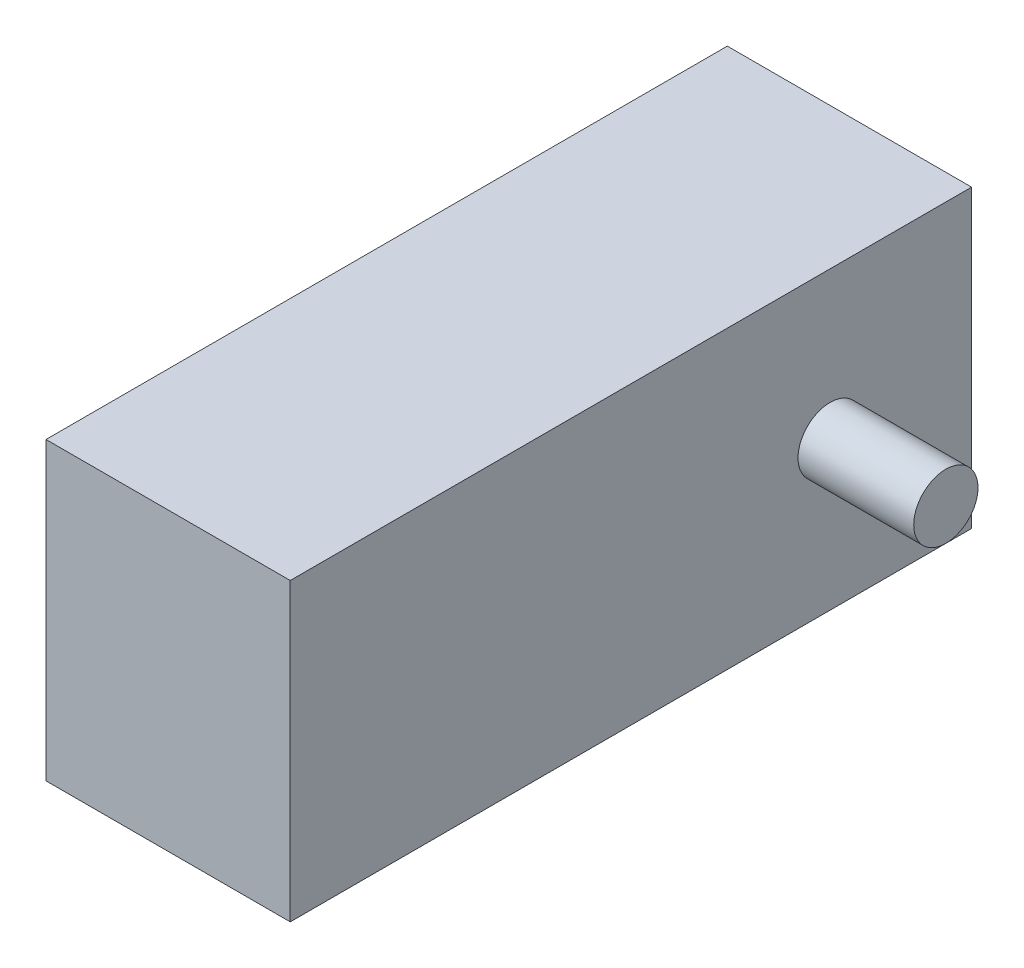
ISO-10303-21;
HEADER;
FILE_DESCRIPTION(('STEP AP214'),'2;1');
FILE_NAME('part.step','',(''),(''),'','','');
FILE_SCHEMA(('AUTOMOTIVE_DESIGN { 1 0 10303 214 1 1 1 1 }'));
ENDSEC;
DATA;
#1=APPLICATION_CONTEXT('core data for automotive mechanical design processes');
#2=APPLICATION_PROTOCOL_DEFINITION('international standard','automotive_design',2000,#1);
#3=PRODUCT_CONTEXT('',#1,'mechanical');
#4=PRODUCT('Part','Part','',(#3));
#5=PRODUCT_RELATED_PRODUCT_CATEGORY('part','',(#4));
#6=PRODUCT_DEFINITION_FORMATION('','',#4);
#7=PRODUCT_DEFINITION_CONTEXT('part definition',#1,'design');
#8=PRODUCT_DEFINITION('design','',#6,#7);
#9=PRODUCT_DEFINITION_SHAPE('','',#8);
#10=(LENGTH_UNIT() NAMED_UNIT(*) SI_UNIT(.MILLI.,.METRE.));
#11=(NAMED_UNIT(*) PLANE_ANGLE_UNIT() SI_UNIT($,.RADIAN.));
#12=(NAMED_UNIT(*) SI_UNIT($,.STERADIAN.) SOLID_ANGLE_UNIT());
#13=UNCERTAINTY_MEASURE_WITH_UNIT(LENGTH_MEASURE(1.E-05),#10,'distance_accuracy_value','');
#14=(GEOMETRIC_REPRESENTATION_CONTEXT(3) GLOBAL_UNCERTAINTY_ASSIGNED_CONTEXT((#13)) GLOBAL_UNIT_ASSIGNED_CONTEXT((#10,
#11,#12)) REPRESENTATION_CONTEXT('',''));
#15=CARTESIAN_POINT('',(0.,0.,0.));
#16=DIRECTION('',(0.,0.,1.));
#17=DIRECTION('',(1.,0.,0.));
#18=AXIS2_PLACEMENT_3D('',#15,#16,#17);
#19=CARTESIAN_POINT('',(19.,15.8704441782996,35.7487156329557));
#20=DIRECTION('',(0.,0.,-1.));
#21=DIRECTION('',(-1.,0.,0.));
#22=AXIS2_PLACEMENT_3D('',#19,#20,#21);
#23=PLANE('',#22);
#24=DIRECTION('',(0.,-1.,0.));
#25=VECTOR('',#24,1.);
#26=CARTESIAN_POINT('',(0.,15.8704441782996,35.7487156329557));
#27=LINE('',#26,#25);
#28=CARTESIAN_POINT('',(0.,38.8704441782996,35.7487156329557));
#29=VERTEX_POINT('',#28);
#30=CARTESIAN_POINT('',(0.,15.8704441782996,35.7487156329557));
#31=VERTEX_POINT('',#30);
#32=EDGE_CURVE('E101',#29,#31,#27,.T.);
#33=ORIENTED_EDGE('',*,*,#32,.T.);
#34=DIRECTION('',(-1.,0.,0.));
#35=VECTOR('',#34,1.);
#36=CARTESIAN_POINT('',(19.,15.8704441782996,35.7487156329557));
#37=LINE('',#36,#35);
#38=CARTESIAN_POINT('',(19.,15.8704441782996,35.7487156329557));
#39=VERTEX_POINT('',#38);
#40=EDGE_CURVE('E43',#39,#31,#37,.T.);
#41=ORIENTED_EDGE('',*,*,#40,.F.);
#42=DIRECTION('',(0.,-1.,0.));
#43=VECTOR('',#42,1.);
#44=CARTESIAN_POINT('',(19.,15.8704441782996,35.7487156329557));
#45=LINE('',#44,#43);
#46=CARTESIAN_POINT('',(19.,38.8704441782996,35.7487156329557));
#47=VERTEX_POINT('',#46);
#48=EDGE_CURVE('E87',#47,#39,#45,.T.);
#49=ORIENTED_EDGE('',*,*,#48,.F.);
#50=DIRECTION('',(-1.,0.,0.));
#51=VECTOR('',#50,1.);
#52=CARTESIAN_POINT('',(19.,38.8704441782996,35.7487156329557));
#53=LINE('',#52,#51);
#54=EDGE_CURVE('E97',#47,#29,#53,.T.);
#55=ORIENTED_EDGE('',*,*,#54,.T.);
#56=EDGE_LOOP('',(#33,#41,#49,#55));
#57=FACE_BOUND('',#56,.T.);
#58=ADVANCED_FACE('F35',(#57),#23,.F.);
#59=CARTESIAN_POINT('',(19.,15.8704441782996,-17.2512843670443));
#60=DIRECTION('',(0.,1.,0.));
#61=DIRECTION('',(0.,0.,1.));
#62=AXIS2_PLACEMENT_3D('',#59,#60,#61);
#63=PLANE('',#62);
#64=DIRECTION('',(0.,0.,-1.));
#65=VECTOR('',#64,1.);
#66=CARTESIAN_POINT('',(0.,15.8704441782996,-17.2512843670443));
#67=LINE('',#66,#65);
#68=CARTESIAN_POINT('',(0.,15.8704441782996,-17.2512843670443));
#69=VERTEX_POINT('',#68);
#70=EDGE_CURVE('E92',#31,#69,#67,.T.);
#71=ORIENTED_EDGE('',*,*,#70,.T.);
#72=DIRECTION('',(-1.,0.,0.));
#73=VECTOR('',#72,1.);
#74=CARTESIAN_POINT('',(19.,15.8704441782996,-17.2512843670443));
#75=LINE('',#74,#73);
#76=CARTESIAN_POINT('',(19.,15.8704441782996,-17.2512843670443));
#77=VERTEX_POINT('',#76);
#78=EDGE_CURVE('E90',#77,#69,#75,.T.);
#79=ORIENTED_EDGE('',*,*,#78,.F.);
#80=DIRECTION('',(0.,0.,-1.));
#81=VECTOR('',#80,1.);
#82=CARTESIAN_POINT('',(19.,15.8704441782996,-17.2512843670443));
#83=LINE('',#82,#81);
#84=EDGE_CURVE('E82',#39,#77,#83,.T.);
#85=ORIENTED_EDGE('',*,*,#84,.F.);
#86=ORIENTED_EDGE('',*,*,#40,.T.);
#87=EDGE_LOOP('',(#71,#79,#85,#86));
#88=FACE_BOUND('',#87,.T.);
#89=ADVANCED_FACE('F91',(#88),#63,.F.);
#90=CARTESIAN_POINT('',(19.,38.8704441782996,-17.2512843670443));
#91=DIRECTION('',(0.,0.,1.));
#92=DIRECTION('',(0.,-1.,0.));
#93=AXIS2_PLACEMENT_3D('',#90,#91,#92);
#94=PLANE('',#93);
#95=DIRECTION('',(0.,1.,0.));
#96=VECTOR('',#95,1.);
#97=CARTESIAN_POINT('',(0.,38.8704441782996,-17.2512843670443));
#98=LINE('',#97,#96);
#99=CARTESIAN_POINT('',(0.,38.8704441782996,-17.2512843670443));
#100=VERTEX_POINT('',#99);
#101=EDGE_CURVE('E68',#69,#100,#98,.T.);
#102=ORIENTED_EDGE('',*,*,#101,.T.);
#103=DIRECTION('',(-1.,0.,0.));
#104=VECTOR('',#103,1.);
#105=CARTESIAN_POINT('',(19.,38.8704441782996,-17.2512843670443));
#106=LINE('',#105,#104);
#107=CARTESIAN_POINT('',(19.,38.8704441782996,-17.2512843670443));
#108=VERTEX_POINT('',#107);
#109=EDGE_CURVE('E93',#108,#100,#106,.T.);
#110=ORIENTED_EDGE('',*,*,#109,.F.);
#111=DIRECTION('',(0.,1.,0.));
#112=VECTOR('',#111,1.);
#113=CARTESIAN_POINT('',(19.,38.8704441782996,-17.2512843670443));
#114=LINE('',#113,#112);
#115=EDGE_CURVE('E85',#77,#108,#114,.T.);
#116=ORIENTED_EDGE('',*,*,#115,.F.);
#117=ORIENTED_EDGE('',*,*,#78,.T.);
#118=EDGE_LOOP('',(#102,#110,#116,#117));
#119=FACE_BOUND('',#118,.T.);
#120=ADVANCED_FACE('F95',(#119),#94,.F.);
#121=CARTESIAN_POINT('',(19.,38.8704441782996,35.7487156329557));
#122=DIRECTION('',(0.,-1.,0.));
#123=DIRECTION('',(0.,0.,-1.));
#124=AXIS2_PLACEMENT_3D('',#121,#122,#123);
#125=PLANE('',#124);
#126=DIRECTION('',(0.,0.,1.));
#127=VECTOR('',#126,1.);
#128=CARTESIAN_POINT('',(0.,38.8704441782996,35.7487156329557));
#129=LINE('',#128,#127);
#130=EDGE_CURVE('E74',#100,#29,#129,.T.);
#131=ORIENTED_EDGE('',*,*,#130,.T.);
#132=ORIENTED_EDGE('',*,*,#54,.F.);
#133=DIRECTION('',(0.,0.,1.));
#134=VECTOR('',#133,1.);
#135=CARTESIAN_POINT('',(19.,38.8704441782996,35.7487156329557));
#136=LINE('',#135,#134);
#137=EDGE_CURVE('E51',#108,#47,#136,.T.);
#138=ORIENTED_EDGE('',*,*,#137,.F.);
#139=ORIENTED_EDGE('',*,*,#109,.T.);
#140=EDGE_LOOP('',(#131,#132,#138,#139));
#141=FACE_BOUND('',#140,.T.);
#142=ADVANCED_FACE('F124',(#141),#125,.F.);
#143=CARTESIAN_POINT('',(19.,0.,0.));
#144=DIRECTION('',(-1.,0.,0.));
#145=DIRECTION('',(0.,0.,1.));
#146=AXIS2_PLACEMENT_3D('',#143,#144,#145);
#147=PLANE('',#146);
#148=CARTESIAN_POINT('',(19.,27.3704441782996,-6.2512843670443));
#149=DIRECTION('',(-1.,0.,0.));
#150=DIRECTION('',(0.,0.,1.));
#151=AXIS2_PLACEMENT_3D('',#148,#149,#150);
#152=CIRCLE('',#151,2.5);
#153=CARTESIAN_POINT('',(19.,27.3704441782996,-3.7512843670443));
#154=VERTEX_POINT('',#153);
#155=EDGE_CURVE('E11',#154,#154,#152,.F.);
#156=ORIENTED_EDGE('',*,*,#155,.F.);
#157=EDGE_LOOP('',(#156));
#158=FACE_BOUND('',#157,.T.);
#159=ORIENTED_EDGE('',*,*,#48,.T.);
#160=ORIENTED_EDGE('',*,*,#84,.T.);
#161=ORIENTED_EDGE('',*,*,#115,.T.);
#162=ORIENTED_EDGE('',*,*,#137,.T.);
#163=EDGE_LOOP('',(#159,#160,#161,#162));
#164=FACE_BOUND('',#163,.T.);
#165=ADVANCED_FACE('F83',(#158,#164),#147,.F.);
#166=CARTESIAN_POINT('',(0.,0.,0.));
#167=DIRECTION('',(-1.,0.,0.));
#168=DIRECTION('',(0.,0.,1.));
#169=AXIS2_PLACEMENT_3D('',#166,#167,#168);
#170=PLANE('',#169);
#171=CARTESIAN_POINT('',(0.,27.3704441782996,-6.2512843670443));
#172=DIRECTION('',(-1.,0.,0.));
#173=DIRECTION('',(0.,0.,1.));
#174=AXIS2_PLACEMENT_3D('',#171,#172,#173);
#175=CIRCLE('',#174,2.5);
#176=CARTESIAN_POINT('',(0.,27.3704441782996,-3.7512843670443));
#177=VERTEX_POINT('',#176);
#178=EDGE_CURVE('E192',#177,#177,#175,.T.);
#179=ORIENTED_EDGE('',*,*,#178,.F.);
#180=EDGE_LOOP('',(#179));
#181=FACE_BOUND('',#180,.T.);
#182=ORIENTED_EDGE('',*,*,#32,.F.);
#183=ORIENTED_EDGE('',*,*,#130,.F.);
#184=ORIENTED_EDGE('',*,*,#101,.F.);
#185=ORIENTED_EDGE('',*,*,#70,.F.);
#186=EDGE_LOOP('',(#182,#183,#184,#185));
#187=FACE_BOUND('',#186,.T.);
#188=ADVANCED_FACE('F112',(#181,#187),#170,.T.);
#189=CARTESIAN_POINT('',(28.,27.3704441782996,-6.2512843670443));
#190=DIRECTION('',(-1.,0.,0.));
#191=DIRECTION('',(0.,0.,1.));
#192=AXIS2_PLACEMENT_3D('',#189,#190,#191);
#193=CYLINDRICAL_SURFACE('',#192,2.5);
#194=CARTESIAN_POINT('',(28.,27.3704441782996,-6.2512843670443));
#195=DIRECTION('',(1.,0.,0.));
#196=DIRECTION('',(0.,0.,-1.));
#197=AXIS2_PLACEMENT_3D('',#194,#195,#196);
#198=CIRCLE('',#197,2.5);
#199=CARTESIAN_POINT('',(28.,27.3704441782996,-8.7512843670443));
#200=VERTEX_POINT('',#199);
#201=EDGE_CURVE('E104',#200,#200,#198,.T.);
#202=ORIENTED_EDGE('',*,*,#201,.F.);
#203=EDGE_LOOP('',(#202));
#204=FACE_BOUND('',#203,.T.);
#205=ORIENTED_EDGE('',*,*,#155,.T.);
#206=EDGE_LOOP('',(#205));
#207=FACE_BOUND('',#206,.T.);
#208=ADVANCED_FACE('F114',(#204,#207),#193,.T.);
#209=CARTESIAN_POINT('',(28.,27.3704441782996,-6.2512843670443));
#210=DIRECTION('',(1.,0.,0.));
#211=DIRECTION('',(0.,0.,-1.));
#212=AXIS2_PLACEMENT_3D('',#209,#210,#211);
#213=PLANE('',#212);
#214=ORIENTED_EDGE('',*,*,#201,.T.);
#215=EDGE_LOOP('',(#214));
#216=FACE_BOUND('',#215,.T.);
#217=ADVANCED_FACE('F121',(#216),#213,.T.);
#218=CARTESIAN_POINT('',(-9.,27.3704441782996,-6.2512843670443));
#219=DIRECTION('',(1.,0.,0.));
#220=DIRECTION('',(0.,0.,-1.));
#221=AXIS2_PLACEMENT_3D('',#218,#219,#220);
#222=CYLINDRICAL_SURFACE('',#221,2.5);
#223=CARTESIAN_POINT('',(-9.,27.3704441782996,-6.2512843670443));
#224=DIRECTION('',(-1.,0.,0.));
#225=DIRECTION('',(0.,0.,1.));
#226=AXIS2_PLACEMENT_3D('',#223,#224,#225);
#227=CIRCLE('',#226,2.5);
#228=CARTESIAN_POINT('',(-9.,27.3704441782996,-3.7512843670443));
#229=VERTEX_POINT('',#228);
#230=EDGE_CURVE('E191',#229,#229,#227,.T.);
#231=ORIENTED_EDGE('',*,*,#230,.F.);
#232=EDGE_LOOP('',(#231));
#233=FACE_BOUND('',#232,.T.);
#234=ORIENTED_EDGE('',*,*,#178,.T.);
#235=EDGE_LOOP('',(#234));
#236=FACE_BOUND('',#235,.T.);
#237=ADVANCED_FACE('F161',(#233,#236),#222,.T.);
#238=CARTESIAN_POINT('',(-9.,27.3704441782996,-6.2512843670443));
#239=DIRECTION('',(-1.,0.,0.));
#240=DIRECTION('',(0.,0.,1.));
#241=AXIS2_PLACEMENT_3D('',#238,#239,#240);
#242=PLANE('',#241);
#243=ORIENTED_EDGE('',*,*,#230,.T.);
#244=EDGE_LOOP('',(#243));
#245=FACE_BOUND('',#244,.T.);
#246=ADVANCED_FACE('F175',(#245),#242,.T.);
#247=CLOSED_SHELL('',(#58,#89,#120,#142,#165,#188,#208,#217,#237,#246));
#248=MANIFOLD_SOLID_BREP('B2',#247);
#249=ADVANCED_BREP_SHAPE_REPRESENTATION('',(#18,#248),#14);
#250=SHAPE_DEFINITION_REPRESENTATION(#9,#249);
ENDSEC;
END-ISO-10303-21;
